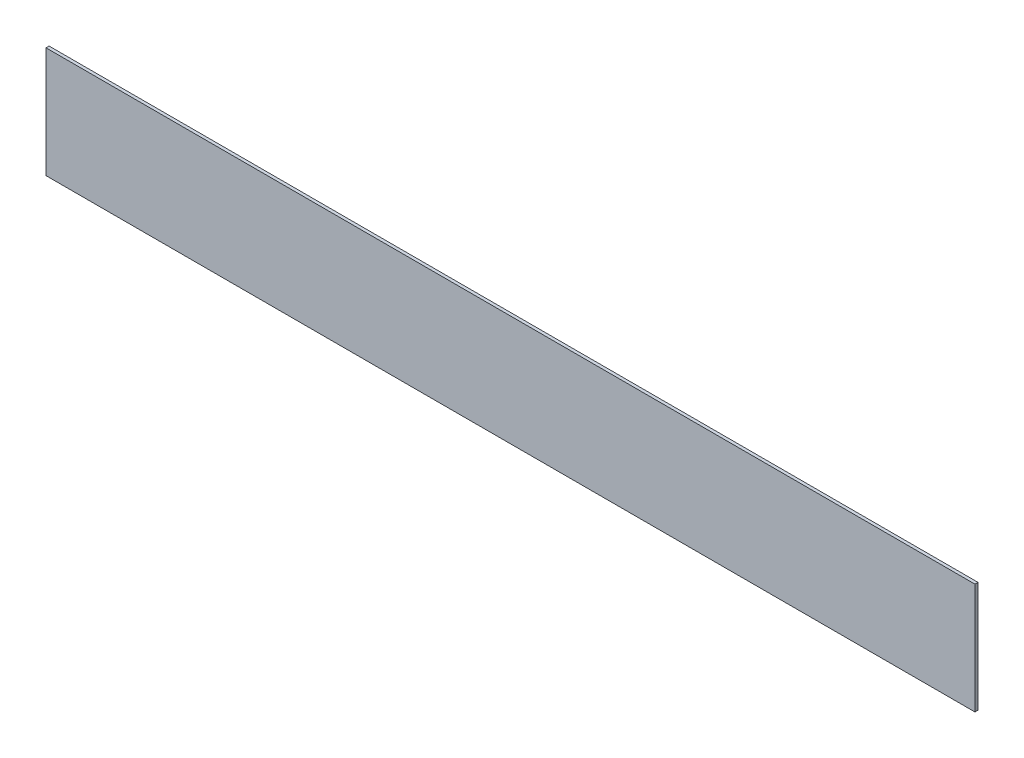
ISO-10303-21;
HEADER;
FILE_DESCRIPTION(('STEP AP214'),'2;1');
FILE_NAME('part.step','',(''),(''),'','','');
FILE_SCHEMA(('AUTOMOTIVE_DESIGN { 1 0 10303 214 1 1 1 1 }'));
ENDSEC;
DATA;
#1=APPLICATION_CONTEXT('core data for automotive mechanical design processes');
#2=APPLICATION_PROTOCOL_DEFINITION('international standard','automotive_design',2000,#1);
#3=PRODUCT_CONTEXT('',#1,'mechanical');
#4=PRODUCT('Part','Part','',(#3));
#5=PRODUCT_RELATED_PRODUCT_CATEGORY('part','',(#4));
#6=PRODUCT_DEFINITION_FORMATION('','',#4);
#7=PRODUCT_DEFINITION_CONTEXT('part definition',#1,'design');
#8=PRODUCT_DEFINITION('design','',#6,#7);
#9=PRODUCT_DEFINITION_SHAPE('','',#8);
#10=(LENGTH_UNIT() NAMED_UNIT(*) SI_UNIT(.MILLI.,.METRE.));
#11=(NAMED_UNIT(*) PLANE_ANGLE_UNIT() SI_UNIT($,.RADIAN.));
#12=(NAMED_UNIT(*) SI_UNIT($,.STERADIAN.) SOLID_ANGLE_UNIT());
#13=UNCERTAINTY_MEASURE_WITH_UNIT(LENGTH_MEASURE(1.E-05),#10,'distance_accuracy_value','');
#14=(GEOMETRIC_REPRESENTATION_CONTEXT(3) GLOBAL_UNCERTAINTY_ASSIGNED_CONTEXT((#13)) GLOBAL_UNIT_ASSIGNED_CONTEXT((#10,
#11,#12)) REPRESENTATION_CONTEXT('',''));
#15=CARTESIAN_POINT('',(0.,0.,0.));
#16=DIRECTION('',(0.,0.,1.));
#17=DIRECTION('',(1.,0.,0.));
#18=AXIS2_PLACEMENT_3D('',#15,#16,#17);
#19=CARTESIAN_POINT('',(158.,57.,27.));
#20=DIRECTION('',(1.,0.,0.));
#21=DIRECTION('',(0.,0.,-1.));
#22=AXIS2_PLACEMENT_3D('',#19,#20,#21);
#23=PLANE('',#22);
#24=DIRECTION('',(0.,-1.,0.));
#25=VECTOR('',#24,1.);
#26=CARTESIAN_POINT('',(158.,57.,26.));
#27=LINE('',#26,#25);
#28=CARTESIAN_POINT('',(158.,93.,26.));
#29=VERTEX_POINT('',#28);
#30=CARTESIAN_POINT('',(158.,57.,26.));
#31=VERTEX_POINT('',#30);
#32=EDGE_CURVE('E102',#29,#31,#27,.T.);
#33=ORIENTED_EDGE('',*,*,#32,.T.);
#34=DIRECTION('',(0.,0.,-1.));
#35=VECTOR('',#34,1.);
#36=CARTESIAN_POINT('',(158.,57.,27.));
#37=LINE('',#36,#35);
#38=CARTESIAN_POINT('',(158.,57.,27.));
#39=VERTEX_POINT('',#38);
#40=EDGE_CURVE('E11',#39,#31,#37,.T.);
#41=ORIENTED_EDGE('',*,*,#40,.F.);
#42=DIRECTION('',(0.,-1.,0.));
#43=VECTOR('',#42,1.);
#44=CARTESIAN_POINT('',(158.,57.,27.));
#45=LINE('',#44,#43);
#46=CARTESIAN_POINT('',(158.,93.,27.));
#47=VERTEX_POINT('',#46);
#48=EDGE_CURVE('E90',#47,#39,#45,.T.);
#49=ORIENTED_EDGE('',*,*,#48,.F.);
#50=DIRECTION('',(0.,0.,-1.));
#51=VECTOR('',#50,1.);
#52=CARTESIAN_POINT('',(158.,93.,27.));
#53=LINE('',#52,#51);
#54=EDGE_CURVE('E98',#47,#29,#53,.T.);
#55=ORIENTED_EDGE('',*,*,#54,.T.);
#56=EDGE_LOOP('',(#33,#41,#49,#55));
#57=FACE_BOUND('',#56,.T.);
#58=ADVANCED_FACE('F39',(#57),#23,.F.);
#59=CARTESIAN_POINT('',(158.,57.,27.));
#60=DIRECTION('',(0.,1.,0.));
#61=DIRECTION('',(0.,0.,1.));
#62=AXIS2_PLACEMENT_3D('',#59,#60,#61);
#63=PLANE('',#62);
#64=DIRECTION('',(1.,0.,0.));
#65=VECTOR('',#64,1.);
#66=CARTESIAN_POINT('',(158.,57.,26.));
#67=LINE('',#66,#65);
#68=CARTESIAN_POINT('',(460.,57.,26.));
#69=VERTEX_POINT('',#68);
#70=EDGE_CURVE('E94',#31,#69,#67,.T.);
#71=ORIENTED_EDGE('',*,*,#70,.T.);
#72=DIRECTION('',(0.,0.,-1.));
#73=VECTOR('',#72,1.);
#74=CARTESIAN_POINT('',(460.,57.,27.));
#75=LINE('',#74,#73);
#76=CARTESIAN_POINT('',(460.,57.,27.));
#77=VERTEX_POINT('',#76);
#78=EDGE_CURVE('E47',#77,#69,#75,.T.);
#79=ORIENTED_EDGE('',*,*,#78,.F.);
#80=DIRECTION('',(1.,0.,0.));
#81=VECTOR('',#80,1.);
#82=CARTESIAN_POINT('',(158.,57.,27.));
#83=LINE('',#82,#81);
#84=EDGE_CURVE('E85',#39,#77,#83,.T.);
#85=ORIENTED_EDGE('',*,*,#84,.F.);
#86=ORIENTED_EDGE('',*,*,#40,.T.);
#87=EDGE_LOOP('',(#71,#79,#85,#86));
#88=FACE_BOUND('',#87,.T.);
#89=ADVANCED_FACE('F93',(#88),#63,.F.);
#90=CARTESIAN_POINT('',(460.,57.,27.));
#91=DIRECTION('',(-1.,0.,0.));
#92=DIRECTION('',(0.,0.,1.));
#93=AXIS2_PLACEMENT_3D('',#90,#91,#92);
#94=PLANE('',#93);
#95=DIRECTION('',(0.,1.,0.));
#96=VECTOR('',#95,1.);
#97=CARTESIAN_POINT('',(460.,57.,26.));
#98=LINE('',#97,#96);
#99=CARTESIAN_POINT('',(460.,93.,26.));
#100=VERTEX_POINT('',#99);
#101=EDGE_CURVE('E72',#69,#100,#98,.T.);
#102=ORIENTED_EDGE('',*,*,#101,.T.);
#103=DIRECTION('',(0.,0.,-1.));
#104=VECTOR('',#103,1.);
#105=CARTESIAN_POINT('',(460.,93.,27.));
#106=LINE('',#105,#104);
#107=CARTESIAN_POINT('',(460.,93.,27.));
#108=VERTEX_POINT('',#107);
#109=EDGE_CURVE('E95',#108,#100,#106,.T.);
#110=ORIENTED_EDGE('',*,*,#109,.F.);
#111=DIRECTION('',(0.,1.,0.));
#112=VECTOR('',#111,1.);
#113=CARTESIAN_POINT('',(460.,57.,27.));
#114=LINE('',#113,#112);
#115=EDGE_CURVE('E88',#77,#108,#114,.T.);
#116=ORIENTED_EDGE('',*,*,#115,.F.);
#117=ORIENTED_EDGE('',*,*,#78,.T.);
#118=EDGE_LOOP('',(#102,#110,#116,#117));
#119=FACE_BOUND('',#118,.T.);
#120=ADVANCED_FACE('F96',(#119),#94,.F.);
#121=CARTESIAN_POINT('',(158.,93.,27.));
#122=DIRECTION('',(0.,-1.,0.));
#123=DIRECTION('',(0.,0.,-1.));
#124=AXIS2_PLACEMENT_3D('',#121,#122,#123);
#125=PLANE('',#124);
#126=DIRECTION('',(-1.,0.,0.));
#127=VECTOR('',#126,1.);
#128=CARTESIAN_POINT('',(158.,93.,26.));
#129=LINE('',#128,#127);
#130=EDGE_CURVE('E78',#100,#29,#129,.T.);
#131=ORIENTED_EDGE('',*,*,#130,.T.);
#132=ORIENTED_EDGE('',*,*,#54,.F.);
#133=DIRECTION('',(-1.,0.,0.));
#134=VECTOR('',#133,1.);
#135=CARTESIAN_POINT('',(158.,93.,27.));
#136=LINE('',#135,#134);
#137=EDGE_CURVE('E55',#108,#47,#136,.T.);
#138=ORIENTED_EDGE('',*,*,#137,.F.);
#139=ORIENTED_EDGE('',*,*,#109,.T.);
#140=EDGE_LOOP('',(#131,#132,#138,#139));
#141=FACE_BOUND('',#140,.T.);
#142=ADVANCED_FACE('F109',(#141),#125,.F.);
#143=CARTESIAN_POINT('',(0.,0.,27.));
#144=DIRECTION('',(0.,0.,-1.));
#145=DIRECTION('',(-1.,0.,0.));
#146=AXIS2_PLACEMENT_3D('',#143,#144,#145);
#147=PLANE('',#146);
#148=ORIENTED_EDGE('',*,*,#48,.T.);
#149=ORIENTED_EDGE('',*,*,#84,.T.);
#150=ORIENTED_EDGE('',*,*,#115,.T.);
#151=ORIENTED_EDGE('',*,*,#137,.T.);
#152=EDGE_LOOP('',(#148,#149,#150,#151));
#153=FACE_BOUND('',#152,.T.);
#154=ADVANCED_FACE('F86',(#153),#147,.F.);
#155=CARTESIAN_POINT('',(0.,0.,26.));
#156=DIRECTION('',(0.,0.,-1.));
#157=DIRECTION('',(-1.,0.,0.));
#158=AXIS2_PLACEMENT_3D('',#155,#156,#157);
#159=PLANE('',#158);
#160=ORIENTED_EDGE('',*,*,#32,.F.);
#161=ORIENTED_EDGE('',*,*,#130,.F.);
#162=ORIENTED_EDGE('',*,*,#101,.F.);
#163=ORIENTED_EDGE('',*,*,#70,.F.);
#164=EDGE_LOOP('',(#160,#161,#162,#163));
#165=FACE_BOUND('',#164,.T.);
#166=ADVANCED_FACE('F112',(#165),#159,.T.);
#167=CLOSED_SHELL('',(#58,#89,#120,#142,#154,#166));
#168=MANIFOLD_SOLID_BREP('B2',#167);
#169=ADVANCED_BREP_SHAPE_REPRESENTATION('',(#18,#168),#14);
#170=SHAPE_DEFINITION_REPRESENTATION(#9,#169);
ENDSEC;
END-ISO-10303-21;
